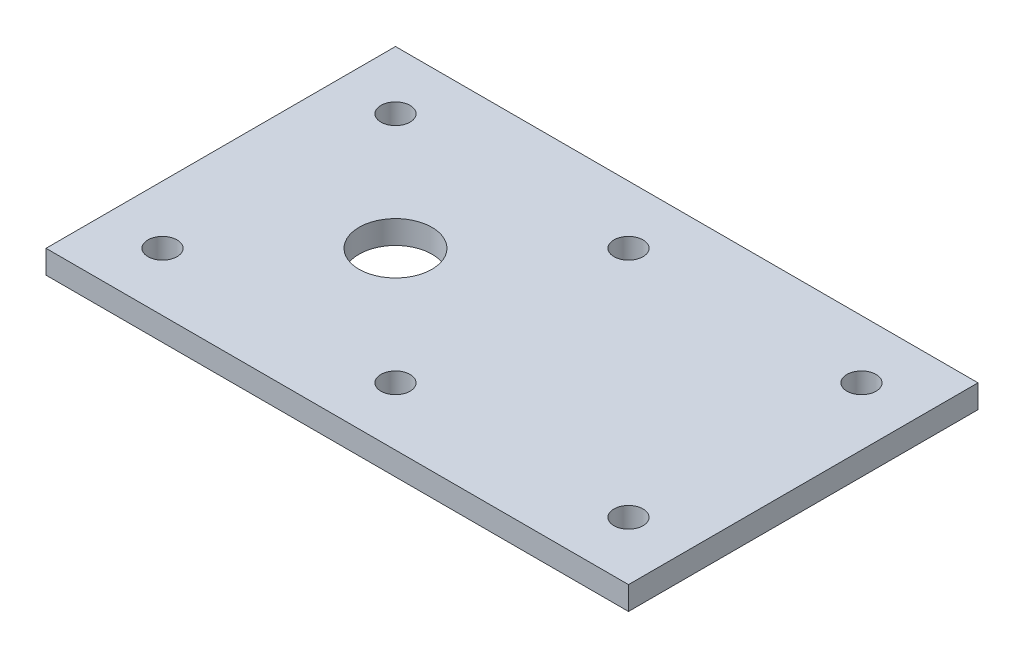
ISO-10303-21;
HEADER;
FILE_DESCRIPTION(('STEP AP214'),'2;1');
FILE_NAME('part.step','',(''),(''),'','','');
FILE_SCHEMA(('AUTOMOTIVE_DESIGN { 1 0 10303 214 1 1 1 1 }'));
ENDSEC;
DATA;
#1=APPLICATION_CONTEXT('core data for automotive mechanical design processes');
#2=APPLICATION_PROTOCOL_DEFINITION('international standard','automotive_design',2000,#1);
#3=PRODUCT_CONTEXT('',#1,'mechanical');
#4=PRODUCT('Part','Part','',(#3));
#5=PRODUCT_RELATED_PRODUCT_CATEGORY('part','',(#4));
#6=PRODUCT_DEFINITION_FORMATION('','',#4);
#7=PRODUCT_DEFINITION_CONTEXT('part definition',#1,'design');
#8=PRODUCT_DEFINITION('design','',#6,#7);
#9=PRODUCT_DEFINITION_SHAPE('','',#8);
#10=(LENGTH_UNIT() NAMED_UNIT(*) SI_UNIT(.MILLI.,.METRE.));
#11=(NAMED_UNIT(*) PLANE_ANGLE_UNIT() SI_UNIT($,.RADIAN.));
#12=(NAMED_UNIT(*) SI_UNIT($,.STERADIAN.) SOLID_ANGLE_UNIT());
#13=UNCERTAINTY_MEASURE_WITH_UNIT(LENGTH_MEASURE(1.E-05),#10,'distance_accuracy_value','');
#14=(GEOMETRIC_REPRESENTATION_CONTEXT(3) GLOBAL_UNCERTAINTY_ASSIGNED_CONTEXT((#13)) GLOBAL_UNIT_ASSIGNED_CONTEXT((#10,
#11,#12)) REPRESENTATION_CONTEXT('',''));
#15=CARTESIAN_POINT('',(0.,0.,0.));
#16=DIRECTION('',(0.,0.,1.));
#17=DIRECTION('',(1.,0.,0.));
#18=AXIS2_PLACEMENT_3D('',#15,#16,#17);
#19=CARTESIAN_POINT('',(120.,0.,40.));
#20=DIRECTION('',(0.,1.,0.));
#21=DIRECTION('',(0.,0.,1.));
#22=AXIS2_PLACEMENT_3D('',#19,#20,#21);
#23=CYLINDRICAL_SURFACE('',#22,5.);
#24=CARTESIAN_POINT('',(120.,0.,40.));
#25=DIRECTION('',(0.,1.,0.));
#26=DIRECTION('',(0.,0.,1.));
#27=AXIS2_PLACEMENT_3D('',#24,#25,#26);
#28=CIRCLE('',#27,5.);
#29=CARTESIAN_POINT('',(120.,0.,45.));
#30=VERTEX_POINT('',#29);
#31=EDGE_CURVE('E44',#30,#30,#28,.T.);
#32=ORIENTED_EDGE('',*,*,#31,.F.);
#33=EDGE_LOOP('',(#32));
#34=FACE_BOUND('',#33,.T.);
#35=CARTESIAN_POINT('',(120.,8.,40.));
#36=DIRECTION('',(0.,1.,0.));
#37=DIRECTION('',(0.,0.,1.));
#38=AXIS2_PLACEMENT_3D('',#35,#36,#37);
#39=CIRCLE('',#38,5.);
#40=CARTESIAN_POINT('',(120.,8.,45.));
#41=VERTEX_POINT('',#40);
#42=EDGE_CURVE('E11',#41,#41,#39,.T.);
#43=ORIENTED_EDGE('',*,*,#42,.T.);
#44=EDGE_LOOP('',(#43));
#45=FACE_BOUND('',#44,.T.);
#46=ADVANCED_FACE('F36',(#34,#45),#23,.F.);
#47=CARTESIAN_POINT('',(120.,0.,-40.));
#48=DIRECTION('',(0.,1.,0.));
#49=DIRECTION('',(0.,0.,1.));
#50=AXIS2_PLACEMENT_3D('',#47,#48,#49);
#51=CYLINDRICAL_SURFACE('',#50,5.);
#52=CARTESIAN_POINT('',(120.,0.,-40.));
#53=DIRECTION('',(0.,1.,0.));
#54=DIRECTION('',(0.,0.,1.));
#55=AXIS2_PLACEMENT_3D('',#52,#53,#54);
#56=CIRCLE('',#55,5.);
#57=CARTESIAN_POINT('',(120.,0.,-35.));
#58=VERTEX_POINT('',#57);
#59=EDGE_CURVE('E126',#58,#58,#56,.T.);
#60=ORIENTED_EDGE('',*,*,#59,.F.);
#61=EDGE_LOOP('',(#60));
#62=FACE_BOUND('',#61,.T.);
#63=CARTESIAN_POINT('',(120.,8.,-40.));
#64=DIRECTION('',(0.,1.,0.));
#65=DIRECTION('',(0.,0.,1.));
#66=AXIS2_PLACEMENT_3D('',#63,#64,#65);
#67=CIRCLE('',#66,5.);
#68=CARTESIAN_POINT('',(120.,8.,-35.));
#69=VERTEX_POINT('',#68);
#70=EDGE_CURVE('E129',#69,#69,#67,.T.);
#71=ORIENTED_EDGE('',*,*,#70,.T.);
#72=EDGE_LOOP('',(#71));
#73=FACE_BOUND('',#72,.T.);
#74=ADVANCED_FACE('F138',(#62,#73),#51,.F.);
#75=CARTESIAN_POINT('',(40.,0.,40.));
#76=DIRECTION('',(0.,1.,0.));
#77=DIRECTION('',(0.,0.,1.));
#78=AXIS2_PLACEMENT_3D('',#75,#76,#77);
#79=CYLINDRICAL_SURFACE('',#78,5.);
#80=CARTESIAN_POINT('',(40.,0.,40.));
#81=DIRECTION('',(0.,1.,0.));
#82=DIRECTION('',(0.,0.,1.));
#83=AXIS2_PLACEMENT_3D('',#80,#81,#82);
#84=CIRCLE('',#83,5.);
#85=CARTESIAN_POINT('',(40.,0.,45.));
#86=VERTEX_POINT('',#85);
#87=EDGE_CURVE('E120',#86,#86,#84,.T.);
#88=ORIENTED_EDGE('',*,*,#87,.F.);
#89=EDGE_LOOP('',(#88));
#90=FACE_BOUND('',#89,.T.);
#91=CARTESIAN_POINT('',(40.,8.,40.));
#92=DIRECTION('',(0.,1.,0.));
#93=DIRECTION('',(0.,0.,1.));
#94=AXIS2_PLACEMENT_3D('',#91,#92,#93);
#95=CIRCLE('',#94,5.);
#96=CARTESIAN_POINT('',(40.,8.,45.));
#97=VERTEX_POINT('',#96);
#98=EDGE_CURVE('E123',#97,#97,#95,.T.);
#99=ORIENTED_EDGE('',*,*,#98,.T.);
#100=EDGE_LOOP('',(#99));
#101=FACE_BOUND('',#100,.T.);
#102=ADVANCED_FACE('F169',(#90,#101),#79,.F.);
#103=CARTESIAN_POINT('',(40.,0.,-40.));
#104=DIRECTION('',(0.,1.,0.));
#105=DIRECTION('',(0.,0.,1.));
#106=AXIS2_PLACEMENT_3D('',#103,#104,#105);
#107=CYLINDRICAL_SURFACE('',#106,5.);
#108=CARTESIAN_POINT('',(40.,0.,-40.));
#109=DIRECTION('',(0.,1.,0.));
#110=DIRECTION('',(0.,0.,1.));
#111=AXIS2_PLACEMENT_3D('',#108,#109,#110);
#112=CIRCLE('',#111,5.);
#113=CARTESIAN_POINT('',(40.,0.,-35.));
#114=VERTEX_POINT('',#113);
#115=EDGE_CURVE('E114',#114,#114,#112,.T.);
#116=ORIENTED_EDGE('',*,*,#115,.F.);
#117=EDGE_LOOP('',(#116));
#118=FACE_BOUND('',#117,.T.);
#119=CARTESIAN_POINT('',(40.,8.,-40.));
#120=DIRECTION('',(0.,1.,0.));
#121=DIRECTION('',(0.,0.,1.));
#122=AXIS2_PLACEMENT_3D('',#119,#120,#121);
#123=CIRCLE('',#122,5.);
#124=CARTESIAN_POINT('',(40.,8.,-35.));
#125=VERTEX_POINT('',#124);
#126=EDGE_CURVE('E117',#125,#125,#123,.T.);
#127=ORIENTED_EDGE('',*,*,#126,.T.);
#128=EDGE_LOOP('',(#127));
#129=FACE_BOUND('',#128,.T.);
#130=ADVANCED_FACE('F165',(#118,#129),#107,.F.);
#131=CARTESIAN_POINT('',(-60.,8.,-60.));
#132=DIRECTION('',(1.,0.,0.));
#133=DIRECTION('',(0.,0.,-1.));
#134=AXIS2_PLACEMENT_3D('',#131,#132,#133);
#135=PLANE('',#134);
#136=DIRECTION('',(0.,0.,1.));
#137=VECTOR('',#136,1.);
#138=CARTESIAN_POINT('',(-60.,0.,-60.));
#139=LINE('',#138,#137);
#140=CARTESIAN_POINT('',(-60.,0.,-60.));
#141=VERTEX_POINT('',#140);
#142=CARTESIAN_POINT('',(-60.,0.,60.));
#143=VERTEX_POINT('',#142);
#144=EDGE_CURVE('E104',#141,#143,#139,.T.);
#145=ORIENTED_EDGE('',*,*,#144,.T.);
#146=DIRECTION('',(0.,-1.,0.));
#147=VECTOR('',#146,1.);
#148=CARTESIAN_POINT('',(-60.,8.,60.));
#149=LINE('',#148,#147);
#150=CARTESIAN_POINT('',(-60.,8.,60.));
#151=VERTEX_POINT('',#150);
#152=EDGE_CURVE('E95',#151,#143,#149,.T.);
#153=ORIENTED_EDGE('',*,*,#152,.F.);
#154=DIRECTION('',(0.,0.,1.));
#155=VECTOR('',#154,1.);
#156=CARTESIAN_POINT('',(-60.,8.,-60.));
#157=LINE('',#156,#155);
#158=CARTESIAN_POINT('',(-60.,8.,-60.));
#159=VERTEX_POINT('',#158);
#160=EDGE_CURVE('E89',#159,#151,#157,.T.);
#161=ORIENTED_EDGE('',*,*,#160,.F.);
#162=DIRECTION('',(0.,-1.,0.));
#163=VECTOR('',#162,1.);
#164=CARTESIAN_POINT('',(-60.,8.,-60.));
#165=LINE('',#164,#163);
#166=EDGE_CURVE('E100',#159,#141,#165,.T.);
#167=ORIENTED_EDGE('',*,*,#166,.T.);
#168=EDGE_LOOP('',(#145,#153,#161,#167));
#169=FACE_BOUND('',#168,.T.);
#170=ADVANCED_FACE('F162',(#169),#135,.F.);
#171=CARTESIAN_POINT('',(-60.,8.,60.));
#172=DIRECTION('',(0.,0.,-1.));
#173=DIRECTION('',(-1.,0.,0.));
#174=AXIS2_PLACEMENT_3D('',#171,#172,#173);
#175=PLANE('',#174);
#176=DIRECTION('',(1.,0.,0.));
#177=VECTOR('',#176,1.);
#178=CARTESIAN_POINT('',(-60.,0.,60.));
#179=LINE('',#178,#177);
#180=CARTESIAN_POINT('',(140.,0.,60.));
#181=VERTEX_POINT('',#180);
#182=EDGE_CURVE('E94',#143,#181,#179,.T.);
#183=ORIENTED_EDGE('',*,*,#182,.T.);
#184=DIRECTION('',(0.,-1.,0.));
#185=VECTOR('',#184,1.);
#186=CARTESIAN_POINT('',(140.,8.,60.));
#187=LINE('',#186,#185);
#188=CARTESIAN_POINT('',(140.,8.,60.));
#189=VERTEX_POINT('',#188);
#190=EDGE_CURVE('E92',#189,#181,#187,.T.);
#191=ORIENTED_EDGE('',*,*,#190,.F.);
#192=DIRECTION('',(1.,0.,0.));
#193=VECTOR('',#192,1.);
#194=CARTESIAN_POINT('',(-60.,8.,60.));
#195=LINE('',#194,#193);
#196=EDGE_CURVE('E83',#151,#189,#195,.T.);
#197=ORIENTED_EDGE('',*,*,#196,.F.);
#198=ORIENTED_EDGE('',*,*,#152,.T.);
#199=EDGE_LOOP('',(#183,#191,#197,#198));
#200=FACE_BOUND('',#199,.T.);
#201=ADVANCED_FACE('F93',(#200),#175,.F.);
#202=CARTESIAN_POINT('',(140.,8.,-60.));
#203=DIRECTION('',(-1.,0.,0.));
#204=DIRECTION('',(0.,0.,1.));
#205=AXIS2_PLACEMENT_3D('',#202,#203,#204);
#206=PLANE('',#205);
#207=DIRECTION('',(0.,0.,-1.));
#208=VECTOR('',#207,1.);
#209=CARTESIAN_POINT('',(140.,0.,-60.));
#210=LINE('',#209,#208);
#211=CARTESIAN_POINT('',(140.,0.,-60.));
#212=VERTEX_POINT('',#211);
#213=EDGE_CURVE('E69',#181,#212,#210,.T.);
#214=ORIENTED_EDGE('',*,*,#213,.T.);
#215=DIRECTION('',(0.,-1.,0.));
#216=VECTOR('',#215,1.);
#217=CARTESIAN_POINT('',(140.,8.,-60.));
#218=LINE('',#217,#216);
#219=CARTESIAN_POINT('',(140.,8.,-60.));
#220=VERTEX_POINT('',#219);
#221=EDGE_CURVE('E96',#220,#212,#218,.T.);
#222=ORIENTED_EDGE('',*,*,#221,.F.);
#223=DIRECTION('',(0.,0.,-1.));
#224=VECTOR('',#223,1.);
#225=CARTESIAN_POINT('',(140.,8.,-60.));
#226=LINE('',#225,#224);
#227=EDGE_CURVE('E87',#189,#220,#226,.T.);
#228=ORIENTED_EDGE('',*,*,#227,.F.);
#229=ORIENTED_EDGE('',*,*,#190,.T.);
#230=EDGE_LOOP('',(#214,#222,#228,#229));
#231=FACE_BOUND('',#230,.T.);
#232=ADVANCED_FACE('F98',(#231),#206,.F.);
#233=CARTESIAN_POINT('',(-60.,8.,-60.));
#234=DIRECTION('',(0.,0.,1.));
#235=DIRECTION('',(1.,0.,0.));
#236=AXIS2_PLACEMENT_3D('',#233,#234,#235);
#237=PLANE('',#236);
#238=DIRECTION('',(-1.,0.,0.));
#239=VECTOR('',#238,1.);
#240=CARTESIAN_POINT('',(-60.,0.,-60.));
#241=LINE('',#240,#239);
#242=EDGE_CURVE('E75',#212,#141,#241,.T.);
#243=ORIENTED_EDGE('',*,*,#242,.T.);
#244=ORIENTED_EDGE('',*,*,#166,.F.);
#245=DIRECTION('',(-1.,0.,0.));
#246=VECTOR('',#245,1.);
#247=CARTESIAN_POINT('',(-60.,8.,-60.));
#248=LINE('',#247,#246);
#249=EDGE_CURVE('E52',#220,#159,#248,.T.);
#250=ORIENTED_EDGE('',*,*,#249,.F.);
#251=ORIENTED_EDGE('',*,*,#221,.T.);
#252=EDGE_LOOP('',(#243,#244,#250,#251));
#253=FACE_BOUND('',#252,.T.);
#254=ADVANCED_FACE('F142',(#253),#237,.F.);
#255=CARTESIAN_POINT('',(0.,8.,0.));
#256=DIRECTION('',(0.,1.,0.));
#257=DIRECTION('',(0.,0.,1.));
#258=AXIS2_PLACEMENT_3D('',#255,#256,#257);
#259=PLANE('',#258);
#260=CARTESIAN_POINT('',(0.,8.,0.));
#261=DIRECTION('',(0.,1.,0.));
#262=DIRECTION('',(0.,0.,1.));
#263=AXIS2_PLACEMENT_3D('',#260,#261,#262);
#264=CIRCLE('',#263,12.5);
#265=CARTESIAN_POINT('',(0.,8.,12.5));
#266=VERTEX_POINT('',#265);
#267=EDGE_CURVE('E292',#266,#266,#264,.T.);
#268=ORIENTED_EDGE('',*,*,#267,.F.);
#269=EDGE_LOOP('',(#268));
#270=FACE_BOUND('',#269,.T.);
#271=CARTESIAN_POINT('',(-40.,8.,40.));
#272=DIRECTION('',(0.,1.,0.));
#273=DIRECTION('',(0.,0.,1.));
#274=AXIS2_PLACEMENT_3D('',#271,#272,#273);
#275=CIRCLE('',#274,5.);
#276=CARTESIAN_POINT('',(-40.,8.,45.));
#277=VERTEX_POINT('',#276);
#278=EDGE_CURVE('E299',#277,#277,#275,.T.);
#279=ORIENTED_EDGE('',*,*,#278,.F.);
#280=EDGE_LOOP('',(#279));
#281=FACE_BOUND('',#280,.T.);
#282=CARTESIAN_POINT('',(-40.,8.,-40.));
#283=DIRECTION('',(0.,1.,0.));
#284=DIRECTION('',(0.,0.,1.));
#285=AXIS2_PLACEMENT_3D('',#282,#283,#284);
#286=CIRCLE('',#285,5.);
#287=CARTESIAN_POINT('',(-40.,8.,-35.));
#288=VERTEX_POINT('',#287);
#289=EDGE_CURVE('E302',#288,#288,#286,.T.);
#290=ORIENTED_EDGE('',*,*,#289,.F.);
#291=EDGE_LOOP('',(#290));
#292=FACE_BOUND('',#291,.T.);
#293=ORIENTED_EDGE('',*,*,#160,.T.);
#294=ORIENTED_EDGE('',*,*,#196,.T.);
#295=ORIENTED_EDGE('',*,*,#227,.T.);
#296=ORIENTED_EDGE('',*,*,#249,.T.);
#297=EDGE_LOOP('',(#293,#294,#295,#296));
#298=FACE_BOUND('',#297,.T.);
#299=ORIENTED_EDGE('',*,*,#126,.F.);
#300=EDGE_LOOP('',(#299));
#301=FACE_BOUND('',#300,.T.);
#302=ORIENTED_EDGE('',*,*,#98,.F.);
#303=EDGE_LOOP('',(#302));
#304=FACE_BOUND('',#303,.T.);
#305=ORIENTED_EDGE('',*,*,#70,.F.);
#306=EDGE_LOOP('',(#305));
#307=FACE_BOUND('',#306,.T.);
#308=ORIENTED_EDGE('',*,*,#42,.F.);
#309=EDGE_LOOP('',(#308));
#310=FACE_BOUND('',#309,.T.);
#311=ADVANCED_FACE('F84',(#270,#281,#292,#298,#301,#304,#307,#310),#259,.T.);
#312=CARTESIAN_POINT('',(0.,0.,0.));
#313=DIRECTION('',(0.,1.,0.));
#314=DIRECTION('',(0.,0.,1.));
#315=AXIS2_PLACEMENT_3D('',#312,#313,#314);
#316=PLANE('',#315);
#317=CARTESIAN_POINT('',(0.,0.,0.));
#318=DIRECTION('',(0.,1.,0.));
#319=DIRECTION('',(0.,0.,1.));
#320=AXIS2_PLACEMENT_3D('',#317,#318,#319);
#321=CIRCLE('',#320,12.5);
#322=CARTESIAN_POINT('',(0.,0.,12.5));
#323=VERTEX_POINT('',#322);
#324=EDGE_CURVE('E290',#323,#323,#321,.T.);
#325=ORIENTED_EDGE('',*,*,#324,.T.);
#326=EDGE_LOOP('',(#325));
#327=FACE_BOUND('',#326,.T.);
#328=CARTESIAN_POINT('',(-40.,0.,40.));
#329=DIRECTION('',(0.,1.,0.));
#330=DIRECTION('',(0.,0.,1.));
#331=AXIS2_PLACEMENT_3D('',#328,#329,#330);
#332=CIRCLE('',#331,5.);
#333=CARTESIAN_POINT('',(-40.,0.,45.));
#334=VERTEX_POINT('',#333);
#335=EDGE_CURVE('E294',#334,#334,#332,.T.);
#336=ORIENTED_EDGE('',*,*,#335,.T.);
#337=EDGE_LOOP('',(#336));
#338=FACE_BOUND('',#337,.T.);
#339=CARTESIAN_POINT('',(-40.,0.,-40.));
#340=DIRECTION('',(0.,1.,0.));
#341=DIRECTION('',(0.,0.,1.));
#342=AXIS2_PLACEMENT_3D('',#339,#340,#341);
#343=CIRCLE('',#342,5.);
#344=CARTESIAN_POINT('',(-40.,0.,-35.));
#345=VERTEX_POINT('',#344);
#346=EDGE_CURVE('E107',#345,#345,#343,.T.);
#347=ORIENTED_EDGE('',*,*,#346,.T.);
#348=EDGE_LOOP('',(#347));
#349=FACE_BOUND('',#348,.T.);
#350=ORIENTED_EDGE('',*,*,#144,.F.);
#351=ORIENTED_EDGE('',*,*,#242,.F.);
#352=ORIENTED_EDGE('',*,*,#213,.F.);
#353=ORIENTED_EDGE('',*,*,#182,.F.);
#354=EDGE_LOOP('',(#350,#351,#352,#353));
#355=FACE_BOUND('',#354,.T.);
#356=ORIENTED_EDGE('',*,*,#115,.T.);
#357=EDGE_LOOP('',(#356));
#358=FACE_BOUND('',#357,.T.);
#359=ORIENTED_EDGE('',*,*,#87,.T.);
#360=EDGE_LOOP('',(#359));
#361=FACE_BOUND('',#360,.T.);
#362=ORIENTED_EDGE('',*,*,#59,.T.);
#363=EDGE_LOOP('',(#362));
#364=FACE_BOUND('',#363,.T.);
#365=ORIENTED_EDGE('',*,*,#31,.T.);
#366=EDGE_LOOP('',(#365));
#367=FACE_BOUND('',#366,.T.);
#368=ADVANCED_FACE('F134',(#327,#338,#349,#355,#358,#361,#364,#367),#316,.F.);
#369=CARTESIAN_POINT('',(-40.,0.,-40.));
#370=DIRECTION('',(0.,1.,0.));
#371=DIRECTION('',(0.,0.,1.));
#372=AXIS2_PLACEMENT_3D('',#369,#370,#371);
#373=CYLINDRICAL_SURFACE('',#372,5.);
#374=ORIENTED_EDGE('',*,*,#346,.F.);
#375=EDGE_LOOP('',(#374));
#376=FACE_BOUND('',#375,.T.);
#377=ORIENTED_EDGE('',*,*,#289,.T.);
#378=EDGE_LOOP('',(#377));
#379=FACE_BOUND('',#378,.T.);
#380=ADVANCED_FACE('F149',(#376,#379),#373,.F.);
#381=CARTESIAN_POINT('',(-40.,0.,40.));
#382=DIRECTION('',(0.,1.,0.));
#383=DIRECTION('',(0.,0.,1.));
#384=AXIS2_PLACEMENT_3D('',#381,#382,#383);
#385=CYLINDRICAL_SURFACE('',#384,5.);
#386=ORIENTED_EDGE('',*,*,#335,.F.);
#387=EDGE_LOOP('',(#386));
#388=FACE_BOUND('',#387,.T.);
#389=ORIENTED_EDGE('',*,*,#278,.T.);
#390=EDGE_LOOP('',(#389));
#391=FACE_BOUND('',#390,.T.);
#392=ADVANCED_FACE('F226',(#388,#391),#385,.F.);
#393=CARTESIAN_POINT('',(0.,0.,0.));
#394=DIRECTION('',(0.,1.,0.));
#395=DIRECTION('',(0.,0.,1.));
#396=AXIS2_PLACEMENT_3D('',#393,#394,#395);
#397=CYLINDRICAL_SURFACE('',#396,12.5);
#398=ORIENTED_EDGE('',*,*,#324,.F.);
#399=EDGE_LOOP('',(#398));
#400=FACE_BOUND('',#399,.T.);
#401=ORIENTED_EDGE('',*,*,#267,.T.);
#402=EDGE_LOOP('',(#401));
#403=FACE_BOUND('',#402,.T.);
#404=ADVANCED_FACE('F232',(#400,#403),#397,.F.);
#405=CLOSED_SHELL('',(#46,#74,#102,#130,#170,#201,#232,#254,#311,#368,#380,#392,#404));
#406=MANIFOLD_SOLID_BREP('B2',#405);
#407=ADVANCED_BREP_SHAPE_REPRESENTATION('',(#18,#406),#14);
#408=SHAPE_DEFINITION_REPRESENTATION(#9,#407);
ENDSEC;
END-ISO-10303-21;
